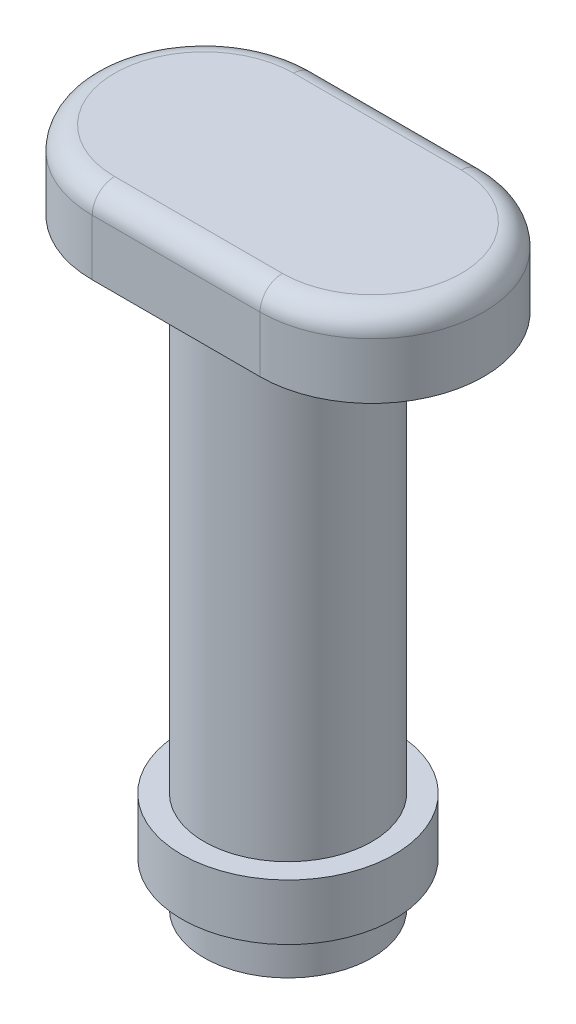
ISO-10303-21;
HEADER;
FILE_DESCRIPTION(('STEP AP214'),'2;1');
FILE_NAME('part.step','',(''),(''),'','','');
FILE_SCHEMA(('AUTOMOTIVE_DESIGN { 1 0 10303 214 1 1 1 1 }'));
ENDSEC;
DATA;
#1=APPLICATION_CONTEXT('core data for automotive mechanical design processes');
#2=APPLICATION_PROTOCOL_DEFINITION('international standard','automotive_design',2000,#1);
#3=PRODUCT_CONTEXT('',#1,'mechanical');
#4=PRODUCT('Part','Part','',(#3));
#5=PRODUCT_RELATED_PRODUCT_CATEGORY('part','',(#4));
#6=PRODUCT_DEFINITION_FORMATION('','',#4);
#7=PRODUCT_DEFINITION_CONTEXT('part definition',#1,'design');
#8=PRODUCT_DEFINITION('design','',#6,#7);
#9=PRODUCT_DEFINITION_SHAPE('','',#8);
#10=(LENGTH_UNIT() NAMED_UNIT(*) SI_UNIT(.MILLI.,.METRE.));
#11=(NAMED_UNIT(*) PLANE_ANGLE_UNIT() SI_UNIT($,.RADIAN.));
#12=(NAMED_UNIT(*) SI_UNIT($,.STERADIAN.) SOLID_ANGLE_UNIT());
#13=UNCERTAINTY_MEASURE_WITH_UNIT(LENGTH_MEASURE(1.E-05),#10,'distance_accuracy_value','');
#14=(GEOMETRIC_REPRESENTATION_CONTEXT(3) GLOBAL_UNCERTAINTY_ASSIGNED_CONTEXT((#13)) GLOBAL_UNIT_ASSIGNED_CONTEXT((#10,
#11,#12)) REPRESENTATION_CONTEXT('',''));
#15=CARTESIAN_POINT('',(0.,0.,0.));
#16=DIRECTION('',(0.,0.,1.));
#17=DIRECTION('',(1.,0.,0.));
#18=AXIS2_PLACEMENT_3D('',#15,#16,#17);
#19=CARTESIAN_POINT('',(0.,-10.,0.));
#20=DIRECTION('',(0.,1.,0.));
#21=DIRECTION('',(0.,0.,1.));
#22=AXIS2_PLACEMENT_3D('',#19,#20,#21);
#23=CYLINDRICAL_SURFACE('',#22,1.5);
#24=CARTESIAN_POINT('',(0.,0.,0.));
#25=DIRECTION('',(0.,-1.,0.));
#26=DIRECTION('',(0.,0.,-1.));
#27=AXIS2_PLACEMENT_3D('',#24,#25,#26);
#28=CIRCLE('',#27,1.5);
#29=CARTESIAN_POINT('',(0.,0.,-1.5));
#30=VERTEX_POINT('',#29);
#31=EDGE_CURVE('E93',#30,#30,#28,.T.);
#32=ORIENTED_EDGE('',*,*,#31,.T.);
#33=EDGE_LOOP('',(#32));
#34=FACE_BOUND('',#33,.T.);
#35=CARTESIAN_POINT('',(0.,-8.2,0.));
#36=DIRECTION('',(0.,-1.,0.));
#37=DIRECTION('',(0.,0.,-1.));
#38=AXIS2_PLACEMENT_3D('',#35,#36,#37);
#39=CIRCLE('',#38,1.5);
#40=CARTESIAN_POINT('',(0.,-8.2,-1.5));
#41=VERTEX_POINT('',#40);
#42=EDGE_CURVE('E125',#41,#41,#39,.T.);
#43=ORIENTED_EDGE('',*,*,#42,.F.);
#44=EDGE_LOOP('',(#43));
#45=FACE_BOUND('',#44,.T.);
#46=ADVANCED_FACE('F33',(#34,#45),#23,.T.);
#47=CARTESIAN_POINT('',(-1.5,1.4,0.));
#48=DIRECTION('',(0.,-1.,0.));
#49=DIRECTION('',(0.,0.,-1.));
#50=AXIS2_PLACEMENT_3D('',#47,#48,#49);
#51=CYLINDRICAL_SURFACE('',#50,2.);
#52=DIRECTION('',(0.,-1.,0.));
#53=VECTOR('',#52,1.);
#54=CARTESIAN_POINT('',(-1.5,1.4,2.));
#55=LINE('',#54,#53);
#56=CARTESIAN_POINT('',(-1.5,1.,2.));
#57=VERTEX_POINT('',#56);
#58=CARTESIAN_POINT('',(-1.5,0.,2.));
#59=VERTEX_POINT('',#58);
#60=EDGE_CURVE('E85',#57,#59,#55,.T.);
#61=ORIENTED_EDGE('',*,*,#60,.F.);
#62=CARTESIAN_POINT('',(-1.5,1.,0.));
#63=DIRECTION('',(0.,1.,0.));
#64=DIRECTION('',(0.,0.,1.));
#65=AXIS2_PLACEMENT_3D('',#62,#63,#64);
#66=CIRCLE('',#65,2.);
#67=CARTESIAN_POINT('',(-1.5,1.,-2.));
#68=VERTEX_POINT('',#67);
#69=EDGE_CURVE('E11',#57,#68,#66,.F.);
#70=ORIENTED_EDGE('',*,*,#69,.T.);
#71=DIRECTION('',(0.,-1.,0.));
#72=VECTOR('',#71,1.);
#73=CARTESIAN_POINT('',(-1.5,1.4,-2.));
#74=LINE('',#73,#72);
#75=CARTESIAN_POINT('',(-1.5,0.,-2.));
#76=VERTEX_POINT('',#75);
#77=EDGE_CURVE('E106',#68,#76,#74,.T.);
#78=ORIENTED_EDGE('',*,*,#77,.T.);
#79=CARTESIAN_POINT('',(-1.5,0.,0.));
#80=DIRECTION('',(0.,1.,0.));
#81=DIRECTION('',(0.,0.,1.));
#82=AXIS2_PLACEMENT_3D('',#79,#80,#81);
#83=CIRCLE('',#82,2.);
#84=EDGE_CURVE('E100',#76,#59,#83,.T.);
#85=ORIENTED_EDGE('',*,*,#84,.T.);
#86=EDGE_LOOP('',(#61,#70,#78,#85));
#87=FACE_BOUND('',#86,.T.);
#88=ADVANCED_FACE('F104',(#87),#51,.T.);
#89=CARTESIAN_POINT('',(-1.5,1.4,2.));
#90=DIRECTION('',(0.,0.,-1.));
#91=DIRECTION('',(-1.,0.,0.));
#92=AXIS2_PLACEMENT_3D('',#89,#90,#91);
#93=PLANE('',#92);
#94=DIRECTION('',(0.,-1.,0.));
#95=VECTOR('',#94,1.);
#96=CARTESIAN_POINT('',(1.5,1.4,2.));
#97=LINE('',#96,#95);
#98=CARTESIAN_POINT('',(1.5,1.,2.));
#99=VERTEX_POINT('',#98);
#100=CARTESIAN_POINT('',(1.5,0.,2.));
#101=VERTEX_POINT('',#100);
#102=EDGE_CURVE('E94',#99,#101,#97,.T.);
#103=ORIENTED_EDGE('',*,*,#102,.F.);
#104=DIRECTION('',(1.,0.,0.));
#105=VECTOR('',#104,1.);
#106=CARTESIAN_POINT('',(-1.5,1.,2.));
#107=LINE('',#106,#105);
#108=EDGE_CURVE('E42',#99,#57,#107,.F.);
#109=ORIENTED_EDGE('',*,*,#108,.T.);
#110=ORIENTED_EDGE('',*,*,#60,.T.);
#111=DIRECTION('',(1.,0.,0.));
#112=VECTOR('',#111,1.);
#113=CARTESIAN_POINT('',(-1.5,0.,2.));
#114=LINE('',#113,#112);
#115=EDGE_CURVE('E88',#59,#101,#114,.T.);
#116=ORIENTED_EDGE('',*,*,#115,.T.);
#117=EDGE_LOOP('',(#103,#109,#110,#116));
#118=FACE_BOUND('',#117,.T.);
#119=ADVANCED_FACE('F87',(#118),#93,.F.);
#120=CARTESIAN_POINT('',(1.5,1.4,0.));
#121=DIRECTION('',(0.,-1.,0.));
#122=DIRECTION('',(0.,0.,-1.));
#123=AXIS2_PLACEMENT_3D('',#120,#121,#122);
#124=CYLINDRICAL_SURFACE('',#123,2.);
#125=DIRECTION('',(0.,-1.,0.));
#126=VECTOR('',#125,1.);
#127=CARTESIAN_POINT('',(1.5,1.4,-2.));
#128=LINE('',#127,#126);
#129=CARTESIAN_POINT('',(1.5,1.,-2.));
#130=VERTEX_POINT('',#129);
#131=CARTESIAN_POINT('',(1.5,0.,-2.));
#132=VERTEX_POINT('',#131);
#133=EDGE_CURVE('E119',#130,#132,#128,.T.);
#134=ORIENTED_EDGE('',*,*,#133,.F.);
#135=CARTESIAN_POINT('',(1.5,1.,0.));
#136=DIRECTION('',(0.,1.,0.));
#137=DIRECTION('',(0.,0.,1.));
#138=AXIS2_PLACEMENT_3D('',#135,#136,#137);
#139=CIRCLE('',#138,2.);
#140=EDGE_CURVE('E57',#130,#99,#139,.F.);
#141=ORIENTED_EDGE('',*,*,#140,.T.);
#142=ORIENTED_EDGE('',*,*,#102,.T.);
#143=CARTESIAN_POINT('',(1.5,0.,0.));
#144=DIRECTION('',(0.,1.,0.));
#145=DIRECTION('',(0.,0.,1.));
#146=AXIS2_PLACEMENT_3D('',#143,#144,#145);
#147=CIRCLE('',#146,2.);
#148=EDGE_CURVE('E102',#101,#132,#147,.T.);
#149=ORIENTED_EDGE('',*,*,#148,.T.);
#150=EDGE_LOOP('',(#134,#141,#142,#149));
#151=FACE_BOUND('',#150,.T.);
#152=ADVANCED_FACE('F234',(#151),#124,.T.);
#153=CARTESIAN_POINT('',(-1.5,1.4,-2.));
#154=DIRECTION('',(0.,0.,1.));
#155=DIRECTION('',(1.,0.,0.));
#156=AXIS2_PLACEMENT_3D('',#153,#154,#155);
#157=PLANE('',#156);
#158=ORIENTED_EDGE('',*,*,#77,.F.);
#159=DIRECTION('',(-1.,0.,0.));
#160=VECTOR('',#159,1.);
#161=CARTESIAN_POINT('',(1.5,1.,-2.));
#162=LINE('',#161,#160);
#163=EDGE_CURVE('E137',#68,#130,#162,.F.);
#164=ORIENTED_EDGE('',*,*,#163,.T.);
#165=ORIENTED_EDGE('',*,*,#133,.T.);
#166=DIRECTION('',(-1.,0.,0.));
#167=VECTOR('',#166,1.);
#168=CARTESIAN_POINT('',(-1.5,0.,-2.));
#169=LINE('',#168,#167);
#170=EDGE_CURVE('E116',#132,#76,#169,.T.);
#171=ORIENTED_EDGE('',*,*,#170,.T.);
#172=EDGE_LOOP('',(#158,#164,#165,#171));
#173=FACE_BOUND('',#172,.T.);
#174=ADVANCED_FACE('F243',(#173),#157,.F.);
#175=CARTESIAN_POINT('',(-1.5,1.4,0.));
#176=DIRECTION('',(0.,1.,0.));
#177=DIRECTION('',(0.,0.,1.));
#178=AXIS2_PLACEMENT_3D('',#175,#176,#177);
#179=PLANE('',#178);
#180=CARTESIAN_POINT('',(1.5,1.4,0.));
#181=DIRECTION('',(0.,1.,0.));
#182=DIRECTION('',(0.,0.,1.));
#183=AXIS2_PLACEMENT_3D('',#180,#181,#182);
#184=CIRCLE('',#183,1.6);
#185=CARTESIAN_POINT('',(1.5,1.4,1.6));
#186=VERTEX_POINT('',#185);
#187=CARTESIAN_POINT('',(1.5,1.4,-1.6));
#188=VERTEX_POINT('',#187);
#189=EDGE_CURVE('E132',#186,#188,#184,.T.);
#190=ORIENTED_EDGE('',*,*,#189,.T.);
#191=DIRECTION('',(-1.,0.,0.));
#192=VECTOR('',#191,1.);
#193=CARTESIAN_POINT('',(-1.5,1.4,-1.6));
#194=LINE('',#193,#192);
#195=CARTESIAN_POINT('',(-1.5,1.4,-1.6));
#196=VERTEX_POINT('',#195);
#197=EDGE_CURVE('E134',#188,#196,#194,.T.);
#198=ORIENTED_EDGE('',*,*,#197,.T.);
#199=CARTESIAN_POINT('',(-1.5,1.4,0.));
#200=DIRECTION('',(0.,1.,0.));
#201=DIRECTION('',(0.,0.,1.));
#202=AXIS2_PLACEMENT_3D('',#199,#200,#201);
#203=CIRCLE('',#202,1.6);
#204=CARTESIAN_POINT('',(-1.5,1.4,1.6));
#205=VERTEX_POINT('',#204);
#206=EDGE_CURVE('E128',#196,#205,#203,.T.);
#207=ORIENTED_EDGE('',*,*,#206,.T.);
#208=DIRECTION('',(1.,0.,0.));
#209=VECTOR('',#208,1.);
#210=CARTESIAN_POINT('',(1.5,1.4,1.6));
#211=LINE('',#210,#209);
#212=EDGE_CURVE('E130',#205,#186,#211,.T.);
#213=ORIENTED_EDGE('',*,*,#212,.T.);
#214=EDGE_LOOP('',(#190,#198,#207,#213));
#215=FACE_BOUND('',#214,.T.);
#216=ADVANCED_FACE('F252',(#215),#179,.T.);
#217=CARTESIAN_POINT('',(-1.5,0.,0.));
#218=DIRECTION('',(0.,1.,0.));
#219=DIRECTION('',(0.,0.,1.));
#220=AXIS2_PLACEMENT_3D('',#217,#218,#219);
#221=PLANE('',#220);
#222=ORIENTED_EDGE('',*,*,#31,.F.);
#223=EDGE_LOOP('',(#222));
#224=FACE_BOUND('',#223,.T.);
#225=ORIENTED_EDGE('',*,*,#84,.F.);
#226=ORIENTED_EDGE('',*,*,#170,.F.);
#227=ORIENTED_EDGE('',*,*,#148,.F.);
#228=ORIENTED_EDGE('',*,*,#115,.F.);
#229=EDGE_LOOP('',(#225,#226,#227,#228));
#230=FACE_BOUND('',#229,.T.);
#231=ADVANCED_FACE('F98',(#224,#230),#221,.F.);
#232=CARTESIAN_POINT('',(0.,-8.2,0.));
#233=DIRECTION('',(0.,-1.,0.));
#234=DIRECTION('',(0.,0.,-1.));
#235=AXIS2_PLACEMENT_3D('',#232,#233,#234);
#236=CYLINDRICAL_SURFACE('',#235,1.9);
#237=CARTESIAN_POINT('',(0.,-8.2,0.));
#238=DIRECTION('',(0.,-1.,0.));
#239=DIRECTION('',(0.,0.,-1.));
#240=AXIS2_PLACEMENT_3D('',#237,#238,#239);
#241=CIRCLE('',#240,1.9);
#242=CARTESIAN_POINT('',(0.,-8.2,-1.9));
#243=VERTEX_POINT('',#242);
#244=EDGE_CURVE('E124',#243,#243,#241,.T.);
#245=ORIENTED_EDGE('',*,*,#244,.T.);
#246=EDGE_LOOP('',(#245));
#247=FACE_BOUND('',#246,.T.);
#248=CARTESIAN_POINT('',(0.,-9.2,0.));
#249=DIRECTION('',(0.,-1.,0.));
#250=DIRECTION('',(0.,0.,-1.));
#251=AXIS2_PLACEMENT_3D('',#248,#249,#250);
#252=CIRCLE('',#251,1.9);
#253=CARTESIAN_POINT('',(0.,-9.2,-1.9));
#254=VERTEX_POINT('',#253);
#255=EDGE_CURVE('E151',#254,#254,#252,.T.);
#256=ORIENTED_EDGE('',*,*,#255,.F.);
#257=EDGE_LOOP('',(#256));
#258=FACE_BOUND('',#257,.T.);
#259=ADVANCED_FACE('F163',(#247,#258),#236,.T.);
#260=CARTESIAN_POINT('',(0.,-8.2,0.));
#261=DIRECTION('',(0.,-1.,0.));
#262=DIRECTION('',(0.,0.,-1.));
#263=AXIS2_PLACEMENT_3D('',#260,#261,#262);
#264=PLANE('',#263);
#265=ORIENTED_EDGE('',*,*,#42,.T.);
#266=EDGE_LOOP('',(#265));
#267=FACE_BOUND('',#266,.T.);
#268=ORIENTED_EDGE('',*,*,#244,.F.);
#269=EDGE_LOOP('',(#268));
#270=FACE_BOUND('',#269,.T.);
#271=ADVANCED_FACE('F166',(#267,#270),#264,.F.);
#272=CARTESIAN_POINT('',(0.,-9.2,0.));
#273=DIRECTION('',(0.,-1.,0.));
#274=DIRECTION('',(0.,0.,-1.));
#275=AXIS2_PLACEMENT_3D('',#272,#273,#274);
#276=PLANE('',#275);
#277=CARTESIAN_POINT('',(0.,-9.2,0.));
#278=DIRECTION('',(0.,-1.,0.));
#279=DIRECTION('',(0.,0.,-1.));
#280=AXIS2_PLACEMENT_3D('',#277,#278,#279);
#281=CIRCLE('',#280,1.5);
#282=CARTESIAN_POINT('',(0.,-9.2,-1.5));
#283=VERTEX_POINT('',#282);
#284=EDGE_CURVE('E111',#283,#283,#281,.T.);
#285=ORIENTED_EDGE('',*,*,#284,.F.);
#286=EDGE_LOOP('',(#285));
#287=FACE_BOUND('',#286,.T.);
#288=ORIENTED_EDGE('',*,*,#255,.T.);
#289=EDGE_LOOP('',(#288));
#290=FACE_BOUND('',#289,.T.);
#291=ADVANCED_FACE('F168',(#287,#290),#276,.T.);
#292=CARTESIAN_POINT('',(0.,-10.,0.));
#293=DIRECTION('',(0.,-1.,0.));
#294=DIRECTION('',(0.,0.,-1.));
#295=AXIS2_PLACEMENT_3D('',#292,#293,#294);
#296=PLANE('',#295);
#297=CARTESIAN_POINT('',(0.,-10.,0.));
#298=DIRECTION('',(0.,-1.,0.));
#299=DIRECTION('',(0.,0.,-1.));
#300=AXIS2_PLACEMENT_3D('',#297,#298,#299);
#301=CIRCLE('',#300,1.5);
#302=CARTESIAN_POINT('',(0.,-10.,-1.5));
#303=VERTEX_POINT('',#302);
#304=EDGE_CURVE('E108',#303,#303,#301,.T.);
#305=ORIENTED_EDGE('',*,*,#304,.T.);
#306=EDGE_LOOP('',(#305));
#307=FACE_BOUND('',#306,.T.);
#308=ADVANCED_FACE('F175',(#307),#296,.T.);
#309=ORIENTED_EDGE('',*,*,#284,.T.);
#310=EDGE_LOOP('',(#309));
#311=FACE_BOUND('',#310,.T.);
#312=ORIENTED_EDGE('',*,*,#304,.F.);
#313=EDGE_LOOP('',(#312));
#314=FACE_BOUND('',#313,.T.);
#315=ADVANCED_FACE('F182',(#311,#314),#23,.T.);
#316=CARTESIAN_POINT('',(-1.5,1.,1.6));
#317=DIRECTION('',(-1.,0.,0.));
#318=DIRECTION('',(0.,0.,1.));
#319=AXIS2_PLACEMENT_3D('',#316,#317,#318);
#320=CYLINDRICAL_SURFACE('',#319,0.4);
#321=CARTESIAN_POINT('',(-1.5,1.,1.6));
#322=DIRECTION('',(-1.,0.,0.));
#323=DIRECTION('',(0.,0.,1.));
#324=AXIS2_PLACEMENT_3D('',#321,#322,#323);
#325=CIRCLE('',#324,0.4);
#326=EDGE_CURVE('E145',#57,#205,#325,.T.);
#327=ORIENTED_EDGE('',*,*,#326,.F.);
#328=ORIENTED_EDGE('',*,*,#108,.F.);
#329=CARTESIAN_POINT('',(1.5,1.,1.6));
#330=DIRECTION('',(1.,0.,0.));
#331=DIRECTION('',(0.,0.,-1.));
#332=AXIS2_PLACEMENT_3D('',#329,#330,#331);
#333=CIRCLE('',#332,0.4);
#334=EDGE_CURVE('E37',#186,#99,#333,.T.);
#335=ORIENTED_EDGE('',*,*,#334,.F.);
#336=ORIENTED_EDGE('',*,*,#212,.F.);
#337=EDGE_LOOP('',(#327,#328,#335,#336));
#338=FACE_BOUND('',#337,.T.);
#339=ADVANCED_FACE('F35',(#338),#320,.T.);
#340=CARTESIAN_POINT('',(1.5,1.,0.));
#341=DIRECTION('',(0.,1.,0.));
#342=DIRECTION('',(0.,0.,1.));
#343=AXIS2_PLACEMENT_3D('',#340,#341,#342);
#344=TOROIDAL_SURFACE('',#343,1.6,0.4);
#345=ORIENTED_EDGE('',*,*,#334,.T.);
#346=ORIENTED_EDGE('',*,*,#140,.F.);
#347=CARTESIAN_POINT('',(1.5,1.,-1.6));
#348=DIRECTION('',(-1.,0.,0.));
#349=DIRECTION('',(0.,0.,1.));
#350=AXIS2_PLACEMENT_3D('',#347,#348,#349);
#351=CIRCLE('',#350,0.4);
#352=EDGE_CURVE('E144',#188,#130,#351,.T.);
#353=ORIENTED_EDGE('',*,*,#352,.F.);
#354=ORIENTED_EDGE('',*,*,#189,.F.);
#355=EDGE_LOOP('',(#345,#346,#353,#354));
#356=FACE_BOUND('',#355,.T.);
#357=ADVANCED_FACE('F197',(#356),#344,.T.);
#358=CARTESIAN_POINT('',(-1.5,1.,0.));
#359=DIRECTION('',(0.,1.,0.));
#360=DIRECTION('',(0.,0.,1.));
#361=AXIS2_PLACEMENT_3D('',#358,#359,#360);
#362=TOROIDAL_SURFACE('',#361,1.6,0.4);
#363=ORIENTED_EDGE('',*,*,#326,.T.);
#364=ORIENTED_EDGE('',*,*,#206,.F.);
#365=CARTESIAN_POINT('',(-1.5,1.,-1.6));
#366=DIRECTION('',(1.,0.,0.));
#367=DIRECTION('',(0.,0.,-1.));
#368=AXIS2_PLACEMENT_3D('',#365,#366,#367);
#369=CIRCLE('',#368,0.4);
#370=EDGE_CURVE('E142',#68,#196,#369,.T.);
#371=ORIENTED_EDGE('',*,*,#370,.F.);
#372=ORIENTED_EDGE('',*,*,#69,.F.);
#373=EDGE_LOOP('',(#363,#364,#371,#372));
#374=FACE_BOUND('',#373,.T.);
#375=ADVANCED_FACE('F276',(#374),#362,.T.);
#376=CARTESIAN_POINT('',(-1.5,1.,-1.6));
#377=DIRECTION('',(1.,0.,0.));
#378=DIRECTION('',(0.,0.,-1.));
#379=AXIS2_PLACEMENT_3D('',#376,#377,#378);
#380=CYLINDRICAL_SURFACE('',#379,0.4);
#381=ORIENTED_EDGE('',*,*,#352,.T.);
#382=ORIENTED_EDGE('',*,*,#163,.F.);
#383=ORIENTED_EDGE('',*,*,#370,.T.);
#384=ORIENTED_EDGE('',*,*,#197,.F.);
#385=EDGE_LOOP('',(#381,#382,#383,#384));
#386=FACE_BOUND('',#385,.T.);
#387=ADVANCED_FACE('F284',(#386),#380,.T.);
#388=CLOSED_SHELL('',(#46,#88,#119,#152,#174,#216,#231,#259,#271,#291,#308,#315,#339,#357,#375,#387));
#389=MANIFOLD_SOLID_BREP('B2',#388);
#390=ADVANCED_BREP_SHAPE_REPRESENTATION('',(#18,#389),#14);
#391=SHAPE_DEFINITION_REPRESENTATION(#9,#390);
ENDSEC;
END-ISO-10303-21;
